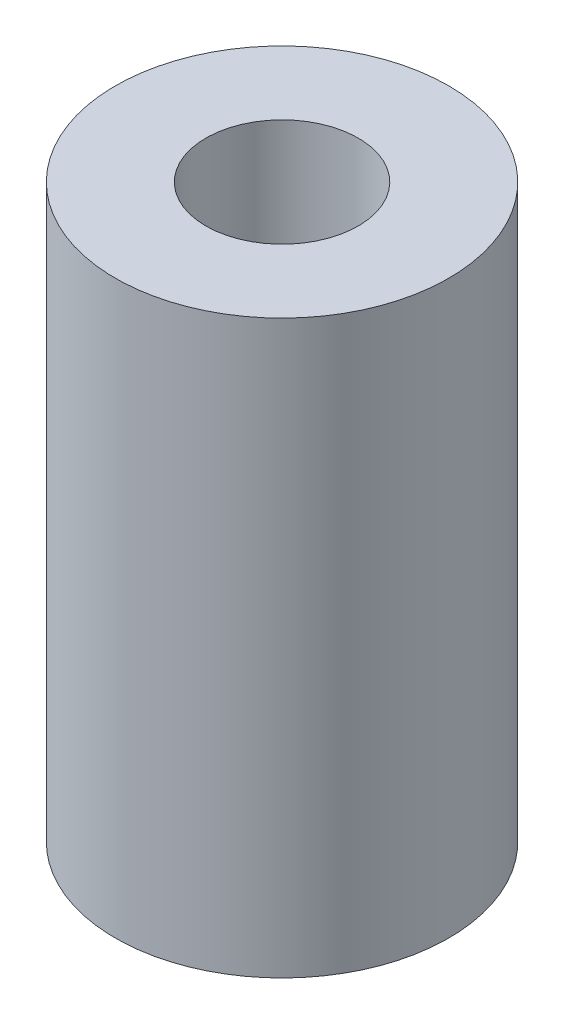
ISO-10303-21;
HEADER;
FILE_DESCRIPTION(('STEP AP214'),'2;1');
FILE_NAME('part.step','',(''),(''),'','','');
FILE_SCHEMA(('AUTOMOTIVE_DESIGN { 1 0 10303 214 1 1 1 1 }'));
ENDSEC;
DATA;
#1=APPLICATION_CONTEXT('core data for automotive mechanical design processes');
#2=APPLICATION_PROTOCOL_DEFINITION('international standard','automotive_design',2000,#1);
#3=PRODUCT_CONTEXT('',#1,'mechanical');
#4=PRODUCT('Part','Part','',(#3));
#5=PRODUCT_RELATED_PRODUCT_CATEGORY('part','',(#4));
#6=PRODUCT_DEFINITION_FORMATION('','',#4);
#7=PRODUCT_DEFINITION_CONTEXT('part definition',#1,'design');
#8=PRODUCT_DEFINITION('design','',#6,#7);
#9=PRODUCT_DEFINITION_SHAPE('','',#8);
#10=(LENGTH_UNIT() NAMED_UNIT(*) SI_UNIT(.MILLI.,.METRE.));
#11=(NAMED_UNIT(*) PLANE_ANGLE_UNIT() SI_UNIT($,.RADIAN.));
#12=(NAMED_UNIT(*) SI_UNIT($,.STERADIAN.) SOLID_ANGLE_UNIT());
#13=UNCERTAINTY_MEASURE_WITH_UNIT(LENGTH_MEASURE(1.E-05),#10,'distance_accuracy_value','');
#14=(GEOMETRIC_REPRESENTATION_CONTEXT(3) GLOBAL_UNCERTAINTY_ASSIGNED_CONTEXT((#13)) GLOBAL_UNIT_ASSIGNED_CONTEXT((#10,
#11,#12)) REPRESENTATION_CONTEXT('',''));
#15=CARTESIAN_POINT('',(0.,0.,0.));
#16=DIRECTION('',(0.,0.,1.));
#17=DIRECTION('',(1.,0.,0.));
#18=AXIS2_PLACEMENT_3D('',#15,#16,#17);
#19=CARTESIAN_POINT('',(0.,6.,0.));
#20=DIRECTION('',(0.,-1.,0.));
#21=DIRECTION('',(0.,0.,-1.));
#22=AXIS2_PLACEMENT_3D('',#19,#20,#21);
#23=PLANE('',#22);
#24=CARTESIAN_POINT('',(0.,6.,0.));
#25=DIRECTION('',(0.,1.,0.));
#26=DIRECTION('',(0.,0.,1.));
#27=AXIS2_PLACEMENT_3D('',#24,#25,#26);
#28=CIRCLE('',#27,0.799999999999999);
#29=CARTESIAN_POINT('',(0.,6.,0.799999999999999));
#30=VERTEX_POINT('',#29);
#31=EDGE_CURVE('E48',#30,#30,#28,.T.);
#32=ORIENTED_EDGE('',*,*,#31,.F.);
#33=EDGE_LOOP('',(#32));
#34=FACE_BOUND('',#33,.T.);
#35=CARTESIAN_POINT('',(0.,6.,0.));
#36=DIRECTION('',(0.,-1.,0.));
#37=DIRECTION('',(0.,0.,-1.));
#38=AXIS2_PLACEMENT_3D('',#35,#36,#37);
#39=CIRCLE('',#38,1.75);
#40=CARTESIAN_POINT('',(0.,6.,-1.75));
#41=VERTEX_POINT('',#40);
#42=EDGE_CURVE('E10',#41,#41,#39,.T.);
#43=ORIENTED_EDGE('',*,*,#42,.F.);
#44=EDGE_LOOP('',(#43));
#45=FACE_BOUND('',#44,.T.);
#46=ADVANCED_FACE('F34',(#34,#45),#23,.F.);
#47=CARTESIAN_POINT('',(0.,0.,0.));
#48=DIRECTION('',(0.,-1.,0.));
#49=DIRECTION('',(0.,0.,-1.));
#50=AXIS2_PLACEMENT_3D('',#47,#48,#49);
#51=CYLINDRICAL_SURFACE('',#50,1.75);
#52=CARTESIAN_POINT('',(0.,0.,0.));
#53=DIRECTION('',(0.,-1.,0.));
#54=DIRECTION('',(0.,0.,-1.));
#55=AXIS2_PLACEMENT_3D('',#52,#53,#54);
#56=CIRCLE('',#55,1.75);
#57=CARTESIAN_POINT('',(0.,0.,-1.75));
#58=VERTEX_POINT('',#57);
#59=EDGE_CURVE('E40',#58,#58,#56,.T.);
#60=ORIENTED_EDGE('',*,*,#59,.F.);
#61=EDGE_LOOP('',(#60));
#62=FACE_BOUND('',#61,.T.);
#63=ORIENTED_EDGE('',*,*,#42,.T.);
#64=EDGE_LOOP('',(#63));
#65=FACE_BOUND('',#64,.T.);
#66=ADVANCED_FACE('F58',(#62,#65),#51,.T.);
#67=CARTESIAN_POINT('',(0.,0.,0.));
#68=DIRECTION('',(0.,1.,0.));
#69=DIRECTION('',(0.,0.,1.));
#70=AXIS2_PLACEMENT_3D('',#67,#68,#69);
#71=PLANE('',#70);
#72=CARTESIAN_POINT('',(0.,0.,0.));
#73=DIRECTION('',(0.,1.,0.));
#74=DIRECTION('',(0.,0.,1.));
#75=AXIS2_PLACEMENT_3D('',#72,#73,#74);
#76=CIRCLE('',#75,0.799999999999999);
#77=CARTESIAN_POINT('',(0.,0.,0.799999999999999));
#78=VERTEX_POINT('',#77);
#79=EDGE_CURVE('E44',#78,#78,#76,.T.);
#80=ORIENTED_EDGE('',*,*,#79,.T.);
#81=EDGE_LOOP('',(#80));
#82=FACE_BOUND('',#81,.T.);
#83=ORIENTED_EDGE('',*,*,#59,.T.);
#84=EDGE_LOOP('',(#83));
#85=FACE_BOUND('',#84,.T.);
#86=ADVANCED_FACE('F62',(#82,#85),#71,.F.);
#87=CARTESIAN_POINT('',(0.,6.,0.));
#88=DIRECTION('',(0.,1.,0.));
#89=DIRECTION('',(0.,0.,1.));
#90=AXIS2_PLACEMENT_3D('',#87,#88,#89);
#91=CYLINDRICAL_SURFACE('',#90,0.799999999999999);
#92=ORIENTED_EDGE('',*,*,#79,.F.);
#93=EDGE_LOOP('',(#92));
#94=FACE_BOUND('',#93,.T.);
#95=ORIENTED_EDGE('',*,*,#31,.T.);
#96=EDGE_LOOP('',(#95));
#97=FACE_BOUND('',#96,.T.);
#98=ADVANCED_FACE('F54',(#94,#97),#91,.F.);
#99=CLOSED_SHELL('',(#46,#66,#86,#98));
#100=MANIFOLD_SOLID_BREP('B2',#99);
#101=ADVANCED_BREP_SHAPE_REPRESENTATION('',(#18,#100),#14);
#102=SHAPE_DEFINITION_REPRESENTATION(#9,#101);
ENDSEC;
END-ISO-10303-21;
